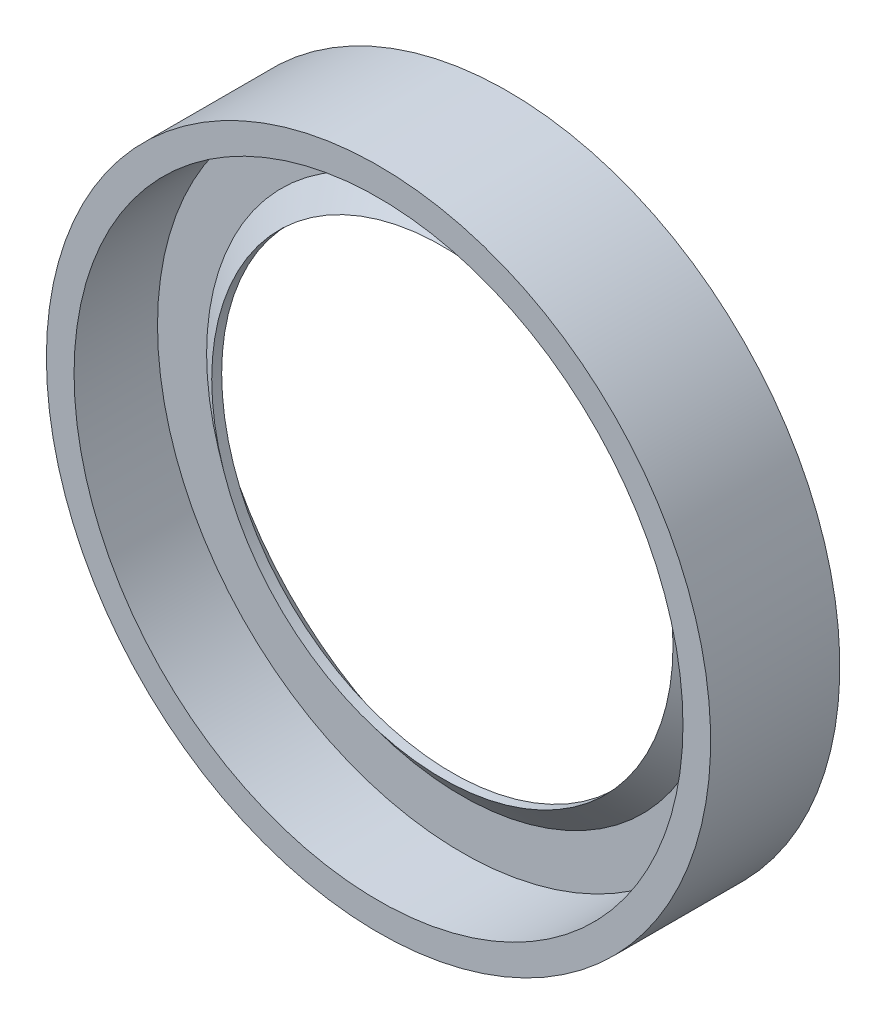
ISO-10303-21;
HEADER;
FILE_DESCRIPTION(('STEP AP214'),'2;1');
FILE_NAME('part.step','',(''),(''),'','','');
FILE_SCHEMA(('AUTOMOTIVE_DESIGN { 1 0 10303 214 1 1 1 1 }'));
ENDSEC;
DATA;
#1=APPLICATION_CONTEXT('core data for automotive mechanical design processes');
#2=APPLICATION_PROTOCOL_DEFINITION('international standard','automotive_design',2000,#1);
#3=PRODUCT_CONTEXT('',#1,'mechanical');
#4=PRODUCT('Part','Part','',(#3));
#5=PRODUCT_RELATED_PRODUCT_CATEGORY('part','',(#4));
#6=PRODUCT_DEFINITION_FORMATION('','',#4);
#7=PRODUCT_DEFINITION_CONTEXT('part definition',#1,'design');
#8=PRODUCT_DEFINITION('design','',#6,#7);
#9=PRODUCT_DEFINITION_SHAPE('','',#8);
#10=(LENGTH_UNIT() NAMED_UNIT(*) SI_UNIT(.MILLI.,.METRE.));
#11=(NAMED_UNIT(*) PLANE_ANGLE_UNIT() SI_UNIT($,.RADIAN.));
#12=(NAMED_UNIT(*) SI_UNIT($,.STERADIAN.) SOLID_ANGLE_UNIT());
#13=UNCERTAINTY_MEASURE_WITH_UNIT(LENGTH_MEASURE(1.E-05),#10,'distance_accuracy_value','');
#14=(GEOMETRIC_REPRESENTATION_CONTEXT(3) GLOBAL_UNCERTAINTY_ASSIGNED_CONTEXT((#13)) GLOBAL_UNIT_ASSIGNED_CONTEXT((#10,
#11,#12)) REPRESENTATION_CONTEXT('',''));
#15=CARTESIAN_POINT('',(0.,0.,0.));
#16=DIRECTION('',(0.,0.,1.));
#17=DIRECTION('',(1.,0.,0.));
#18=AXIS2_PLACEMENT_3D('',#15,#16,#17);
#19=CARTESIAN_POINT('',(0.,0.,-48.3595845394741));
#20=DIRECTION('',(0.,0.,-1.));
#21=DIRECTION('',(-1.,0.,0.));
#22=AXIS2_PLACEMENT_3D('',#19,#20,#21);
#23=CYLINDRICAL_SURFACE('',#22,16.5);
#24=CARTESIAN_POINT('',(0.,0.,-4.52276635228337));
#25=DIRECTION('',(0.,0.,-1.));
#26=DIRECTION('',(-1.,0.,0.));
#27=AXIS2_PLACEMENT_3D('',#24,#25,#26);
#28=CIRCLE('',#27,16.5);
#29=CARTESIAN_POINT('',(-16.5,0.,-4.52276635228337));
#30=VERTEX_POINT('',#29);
#31=EDGE_CURVE('E60',#30,#30,#28,.T.);
#32=ORIENTED_EDGE('',*,*,#31,.T.);
#33=EDGE_LOOP('',(#32));
#34=FACE_BOUND('',#33,.T.);
#35=CARTESIAN_POINT('',(0.,0.,0.));
#36=DIRECTION('',(0.,0.,-1.));
#37=DIRECTION('',(-1.,0.,0.));
#38=AXIS2_PLACEMENT_3D('',#35,#36,#37);
#39=CIRCLE('',#38,16.5);
#40=CARTESIAN_POINT('',(-16.5,0.,0.));
#41=VERTEX_POINT('',#40);
#42=EDGE_CURVE('E10',#41,#41,#39,.T.);
#43=ORIENTED_EDGE('',*,*,#42,.F.);
#44=EDGE_LOOP('',(#43));
#45=FACE_BOUND('',#44,.T.);
#46=ADVANCED_FACE('F32',(#34,#45),#23,.F.);
#47=CARTESIAN_POINT('',(0.,16.5,0.));
#48=DIRECTION('',(0.,0.,1.));
#49=DIRECTION('',(1.,0.,0.));
#50=AXIS2_PLACEMENT_3D('',#47,#48,#49);
#51=PLANE('',#50);
#52=ORIENTED_EDGE('',*,*,#42,.T.);
#53=EDGE_LOOP('',(#52));
#54=FACE_BOUND('',#53,.T.);
#55=CARTESIAN_POINT('',(0.,0.,0.));
#56=DIRECTION('',(0.,0.,-1.));
#57=DIRECTION('',(-1.,0.,0.));
#58=AXIS2_PLACEMENT_3D('',#55,#56,#57);
#59=CIRCLE('',#58,18.);
#60=CARTESIAN_POINT('',(-18.,0.,0.));
#61=VERTEX_POINT('',#60);
#62=EDGE_CURVE('E38',#61,#61,#59,.T.);
#63=ORIENTED_EDGE('',*,*,#62,.F.);
#64=EDGE_LOOP('',(#63));
#65=FACE_BOUND('',#64,.T.);
#66=ADVANCED_FACE('F78',(#54,#65),#51,.T.);
#67=CARTESIAN_POINT('',(0.,0.,-48.3595845394741));
#68=DIRECTION('',(0.,0.,-1.));
#69=DIRECTION('',(-1.,0.,0.));
#70=AXIS2_PLACEMENT_3D('',#67,#68,#69);
#71=CYLINDRICAL_SURFACE('',#70,18.);
#72=ORIENTED_EDGE('',*,*,#62,.T.);
#73=EDGE_LOOP('',(#72));
#74=FACE_BOUND('',#73,.T.);
#75=CARTESIAN_POINT('',(0.,0.,-7.));
#76=DIRECTION('',(0.,0.,-1.));
#77=DIRECTION('',(-1.,0.,0.));
#78=AXIS2_PLACEMENT_3D('',#75,#76,#77);
#79=CIRCLE('',#78,18.);
#80=CARTESIAN_POINT('',(-18.,0.,-7.));
#81=VERTEX_POINT('',#80);
#82=EDGE_CURVE('E42',#81,#81,#79,.T.);
#83=ORIENTED_EDGE('',*,*,#82,.F.);
#84=EDGE_LOOP('',(#83));
#85=FACE_BOUND('',#84,.T.);
#86=ADVANCED_FACE('F82',(#74,#85),#71,.T.);
#87=CARTESIAN_POINT('',(0.,18.,-7.));
#88=DIRECTION('',(0.,0.,-1.));
#89=DIRECTION('',(-1.,0.,0.));
#90=AXIS2_PLACEMENT_3D('',#87,#88,#89);
#91=PLANE('',#90);
#92=ORIENTED_EDGE('',*,*,#82,.T.);
#93=EDGE_LOOP('',(#92));
#94=FACE_BOUND('',#93,.T.);
#95=CARTESIAN_POINT('',(0.,0.,-7.));
#96=DIRECTION('',(0.,0.,-1.));
#97=DIRECTION('',(-1.,0.,0.));
#98=AXIS2_PLACEMENT_3D('',#95,#96,#97);
#99=CIRCLE('',#98,16.5);
#100=CARTESIAN_POINT('',(-16.5,0.,-7.));
#101=VERTEX_POINT('',#100);
#102=EDGE_CURVE('E46',#101,#101,#99,.T.);
#103=ORIENTED_EDGE('',*,*,#102,.F.);
#104=EDGE_LOOP('',(#103));
#105=FACE_BOUND('',#104,.T.);
#106=ADVANCED_FACE('F86',(#94,#105),#91,.T.);
#107=CARTESIAN_POINT('',(0.,0.,-4.));
#108=DIRECTION('',(0.,0.,-1.));
#109=DIRECTION('',(-1.,0.,0.));
#110=AXIS2_PLACEMENT_3D('',#107,#108,#109);
#111=CONICAL_SURFACE('',#110,12.5,0.927295218001612);
#112=ORIENTED_EDGE('',*,*,#102,.T.);
#113=EDGE_LOOP('',(#112));
#114=FACE_BOUND('',#113,.T.);
#115=CARTESIAN_POINT('',(0.,0.,-4.));
#116=DIRECTION('',(0.,0.,-1.));
#117=DIRECTION('',(-1.,0.,0.));
#118=AXIS2_PLACEMENT_3D('',#115,#116,#117);
#119=CIRCLE('',#118,12.5);
#120=CARTESIAN_POINT('',(-12.5,0.,-4.));
#121=VERTEX_POINT('',#120);
#122=EDGE_CURVE('E51',#121,#121,#119,.T.);
#123=ORIENTED_EDGE('',*,*,#122,.F.);
#124=EDGE_LOOP('',(#123));
#125=FACE_BOUND('',#124,.T.);
#126=ADVANCED_FACE('F92',(#114,#125),#111,.F.);
#127=CARTESIAN_POINT('',(0.,0.,-48.3595845394741));
#128=DIRECTION('',(0.,0.,-1.));
#129=DIRECTION('',(-1.,0.,0.));
#130=AXIS2_PLACEMENT_3D('',#127,#128,#129);
#131=CYLINDRICAL_SURFACE('',#130,12.5);
#132=ORIENTED_EDGE('',*,*,#122,.T.);
#133=EDGE_LOOP('',(#132));
#134=FACE_BOUND('',#133,.T.);
#135=CARTESIAN_POINT('',(0.,0.,-3.46020776222881));
#136=DIRECTION('',(0.,0.,-1.));
#137=DIRECTION('',(-1.,0.,0.));
#138=AXIS2_PLACEMENT_3D('',#135,#136,#137);
#139=CIRCLE('',#138,12.5);
#140=CARTESIAN_POINT('',(-12.5,0.,-3.46020776222881));
#141=VERTEX_POINT('',#140);
#142=EDGE_CURVE('E54',#141,#141,#139,.T.);
#143=ORIENTED_EDGE('',*,*,#142,.F.);
#144=EDGE_LOOP('',(#143));
#145=FACE_BOUND('',#144,.T.);
#146=ADVANCED_FACE('F74',(#134,#145),#131,.F.);
#147=CARTESIAN_POINT('',(0.,0.,-4.52276635228337));
#148=DIRECTION('',(0.,0.,-1.));
#149=DIRECTION('',(-1.,0.,0.));
#150=AXIS2_PLACEMENT_3D('',#147,#148,#149);
#151=CONICAL_SURFACE('',#150,13.839763520581,0.900280486153661);
#152=ORIENTED_EDGE('',*,*,#142,.T.);
#153=EDGE_LOOP('',(#152));
#154=FACE_BOUND('',#153,.T.);
#155=CARTESIAN_POINT('',(0.,0.,-4.52276635228337));
#156=DIRECTION('',(0.,0.,-1.));
#157=DIRECTION('',(-1.,0.,0.));
#158=AXIS2_PLACEMENT_3D('',#155,#156,#157);
#159=CIRCLE('',#158,13.839763520581);
#160=CARTESIAN_POINT('',(-13.839763520581,0.,-4.52276635228337));
#161=VERTEX_POINT('',#160);
#162=EDGE_CURVE('E57',#161,#161,#159,.T.);
#163=ORIENTED_EDGE('',*,*,#162,.F.);
#164=EDGE_LOOP('',(#163));
#165=FACE_BOUND('',#164,.T.);
#166=ADVANCED_FACE('F68',(#154,#165),#151,.T.);
#167=CARTESIAN_POINT('',(0.,13.839763520581,-4.52276635228337));
#168=DIRECTION('',(0.,0.,1.));
#169=DIRECTION('',(1.,0.,0.));
#170=AXIS2_PLACEMENT_3D('',#167,#168,#169);
#171=PLANE('',#170);
#172=ORIENTED_EDGE('',*,*,#162,.T.);
#173=EDGE_LOOP('',(#172));
#174=FACE_BOUND('',#173,.T.);
#175=ORIENTED_EDGE('',*,*,#31,.F.);
#176=EDGE_LOOP('',(#175));
#177=FACE_BOUND('',#176,.T.);
#178=ADVANCED_FACE('F66',(#174,#177),#171,.T.);
#179=CLOSED_SHELL('',(#46,#66,#86,#106,#126,#146,#166,#178));
#180=MANIFOLD_SOLID_BREP('B2',#179);
#181=ADVANCED_BREP_SHAPE_REPRESENTATION('',(#18,#180),#14);
#182=SHAPE_DEFINITION_REPRESENTATION(#9,#181);
ENDSEC;
END-ISO-10303-21;
